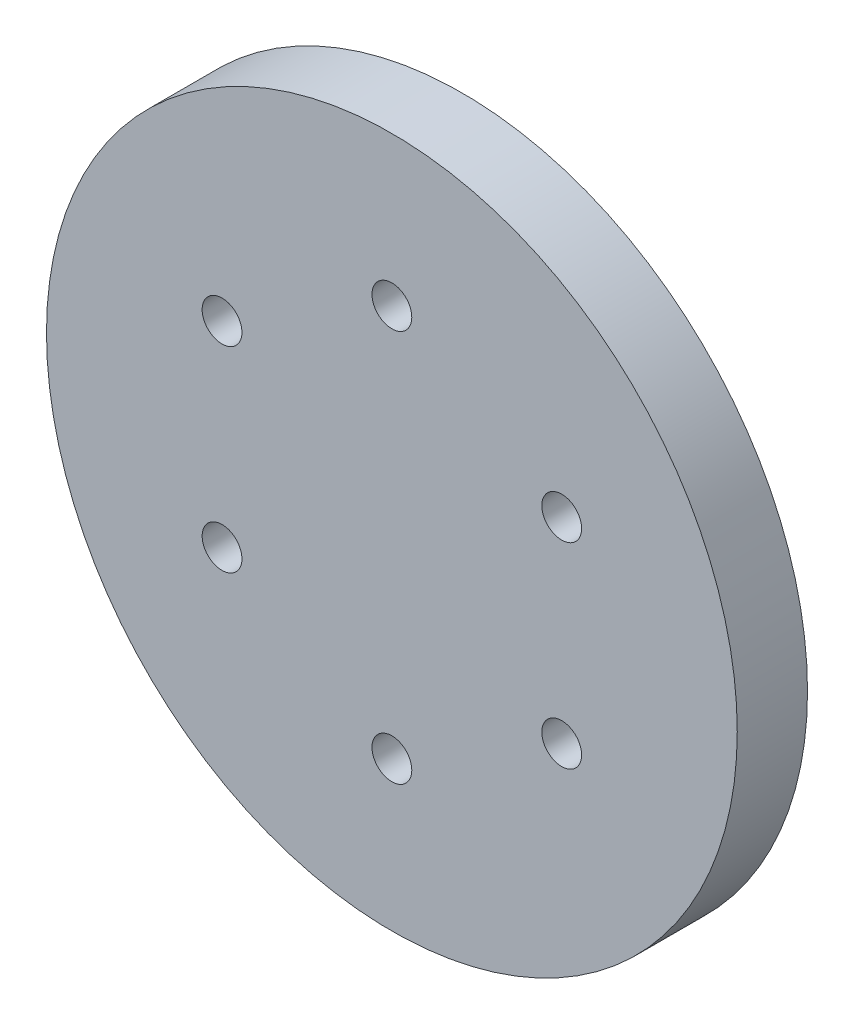
ISO-10303-21;
HEADER;
FILE_DESCRIPTION(('STEP AP214'),'2;1');
FILE_NAME('part.step','',(''),(''),'','','');
FILE_SCHEMA(('AUTOMOTIVE_DESIGN { 1 0 10303 214 1 1 1 1 }'));
ENDSEC;
DATA;
#1=APPLICATION_CONTEXT('core data for automotive mechanical design processes');
#2=APPLICATION_PROTOCOL_DEFINITION('international standard','automotive_design',2000,#1);
#3=PRODUCT_CONTEXT('',#1,'mechanical');
#4=PRODUCT('Part','Part','',(#3));
#5=PRODUCT_RELATED_PRODUCT_CATEGORY('part','',(#4));
#6=PRODUCT_DEFINITION_FORMATION('','',#4);
#7=PRODUCT_DEFINITION_CONTEXT('part definition',#1,'design');
#8=PRODUCT_DEFINITION('design','',#6,#7);
#9=PRODUCT_DEFINITION_SHAPE('','',#8);
#10=(LENGTH_UNIT() NAMED_UNIT(*) SI_UNIT(.MILLI.,.METRE.));
#11=(NAMED_UNIT(*) PLANE_ANGLE_UNIT() SI_UNIT($,.RADIAN.));
#12=(NAMED_UNIT(*) SI_UNIT($,.STERADIAN.) SOLID_ANGLE_UNIT());
#13=UNCERTAINTY_MEASURE_WITH_UNIT(LENGTH_MEASURE(1.E-05),#10,'distance_accuracy_value','');
#14=(GEOMETRIC_REPRESENTATION_CONTEXT(3) GLOBAL_UNCERTAINTY_ASSIGNED_CONTEXT((#13)) GLOBAL_UNIT_ASSIGNED_CONTEXT((#10,
#11,#12)) REPRESENTATION_CONTEXT('',''));
#15=CARTESIAN_POINT('',(0.,0.,0.));
#16=DIRECTION('',(0.,0.,1.));
#17=DIRECTION('',(1.,0.,0.));
#18=AXIS2_PLACEMENT_3D('',#15,#16,#17);
#19=CARTESIAN_POINT('',(0.,0.,3.));
#20=DIRECTION('',(0.,0.,1.));
#21=DIRECTION('',(1.,0.,0.));
#22=AXIS2_PLACEMENT_3D('',#19,#20,#21);
#23=PLANE('',#22);
#24=CARTESIAN_POINT('',(14.5059255133892,-8.37500000000027,3.));
#25=DIRECTION('',(0.,0.,1.));
#26=DIRECTION('',(1.,0.,0.));
#27=AXIS2_PLACEMENT_3D('',#24,#25,#26);
#28=CIRCLE('',#27,1.7);
#29=CARTESIAN_POINT('',(16.2059255133892,-8.37500000000027,3.));
#30=VERTEX_POINT('',#29);
#31=EDGE_CURVE('E88',#30,#30,#28,.T.);
#32=ORIENTED_EDGE('',*,*,#31,.F.);
#33=EDGE_LOOP('',(#32));
#34=FACE_BOUND('',#33,.T.);
#35=CARTESIAN_POINT('',(2.37657116208823E-13,16.75,3.));
#36=DIRECTION('',(0.,0.,1.));
#37=DIRECTION('',(1.,0.,0.));
#38=AXIS2_PLACEMENT_3D('',#35,#36,#37);
#39=CIRCLE('',#38,1.7);
#40=CARTESIAN_POINT('',(1.70000000000024,16.75,3.));
#41=VERTEX_POINT('',#40);
#42=EDGE_CURVE('E72',#41,#41,#39,.T.);
#43=ORIENTED_EDGE('',*,*,#42,.F.);
#44=EDGE_LOOP('',(#43));
#45=FACE_BOUND('',#44,.T.);
#46=CARTESIAN_POINT('',(-14.5059255133894,-8.37499999999986,3.));
#47=DIRECTION('',(0.,0.,1.));
#48=DIRECTION('',(1.,0.,0.));
#49=AXIS2_PLACEMENT_3D('',#46,#47,#48);
#50=CIRCLE('',#49,1.7);
#51=CARTESIAN_POINT('',(-12.8059255133894,-8.37499999999986,3.));
#52=VERTEX_POINT('',#51);
#53=EDGE_CURVE('E53',#52,#52,#50,.T.);
#54=ORIENTED_EDGE('',*,*,#53,.F.);
#55=EDGE_LOOP('',(#54));
#56=FACE_BOUND('',#55,.T.);
#57=CARTESIAN_POINT('',(-14.5059255133893,8.37500000000017,3.));
#58=DIRECTION('',(0.,0.,1.));
#59=DIRECTION('',(1.,0.,0.));
#60=AXIS2_PLACEMENT_3D('',#57,#58,#59);
#61=CIRCLE('',#60,1.7);
#62=CARTESIAN_POINT('',(-12.8059255133893,8.37500000000017,3.));
#63=VERTEX_POINT('',#62);
#64=EDGE_CURVE('E67',#63,#63,#61,.T.);
#65=ORIENTED_EDGE('',*,*,#64,.F.);
#66=EDGE_LOOP('',(#65));
#67=FACE_BOUND('',#66,.T.);
#68=CARTESIAN_POINT('',(14.5059255133895,8.37499999999976,3.));
#69=DIRECTION('',(0.,0.,1.));
#70=DIRECTION('',(1.,0.,0.));
#71=AXIS2_PLACEMENT_3D('',#68,#69,#70);
#72=CIRCLE('',#71,1.7);
#73=CARTESIAN_POINT('',(16.2059255133895,8.37499999999976,3.));
#74=VERTEX_POINT('',#73);
#75=EDGE_CURVE('E80',#74,#74,#72,.T.);
#76=ORIENTED_EDGE('',*,*,#75,.F.);
#77=EDGE_LOOP('',(#76));
#78=FACE_BOUND('',#77,.T.);
#79=CARTESIAN_POINT('',(-3.5301622736128E-13,-16.75,3.));
#80=DIRECTION('',(0.,0.,1.));
#81=DIRECTION('',(1.,0.,0.));
#82=AXIS2_PLACEMENT_3D('',#79,#80,#81);
#83=CIRCLE('',#82,1.7);
#84=CARTESIAN_POINT('',(1.69999999999965,-16.75,3.));
#85=VERTEX_POINT('',#84);
#86=EDGE_CURVE('E96',#85,#85,#83,.T.);
#87=ORIENTED_EDGE('',*,*,#86,.F.);
#88=EDGE_LOOP('',(#87));
#89=FACE_BOUND('',#88,.T.);
#90=CARTESIAN_POINT('',(0.,0.,3.));
#91=DIRECTION('',(0.,0.,1.));
#92=DIRECTION('',(1.,0.,0.));
#93=AXIS2_PLACEMENT_3D('',#90,#91,#92);
#94=CIRCLE('',#93,29.5);
#95=CARTESIAN_POINT('',(29.5,0.,3.));
#96=VERTEX_POINT('',#95);
#97=EDGE_CURVE('E107',#96,#96,#94,.T.);
#98=ORIENTED_EDGE('',*,*,#97,.T.);
#99=EDGE_LOOP('',(#98));
#100=FACE_BOUND('',#99,.T.);
#101=ADVANCED_FACE('F45',(#34,#45,#56,#67,#78,#89,#100),#23,.T.);
#102=CARTESIAN_POINT('',(0.,0.,0.));
#103=DIRECTION('',(0.,0.,1.));
#104=DIRECTION('',(1.,0.,0.));
#105=AXIS2_PLACEMENT_3D('',#102,#103,#104);
#106=PLANE('',#105);
#107=CARTESIAN_POINT('',(0.,0.,0.));
#108=DIRECTION('',(0.,0.,1.));
#109=DIRECTION('',(1.,0.,0.));
#110=AXIS2_PLACEMENT_3D('',#107,#108,#109);
#111=CIRCLE('',#110,27.6);
#112=CARTESIAN_POINT('',(27.6,0.,0.));
#113=VERTEX_POINT('',#112);
#114=EDGE_CURVE('E10',#113,#113,#111,.T.);
#115=ORIENTED_EDGE('',*,*,#114,.F.);
#116=EDGE_LOOP('',(#115));
#117=FACE_BOUND('',#116,.T.);
#118=CARTESIAN_POINT('',(-14.5059255133894,-8.37499999999986,0.));
#119=DIRECTION('',(0.,0.,1.));
#120=DIRECTION('',(1.,0.,0.));
#121=AXIS2_PLACEMENT_3D('',#118,#119,#120);
#122=CIRCLE('',#121,1.7);
#123=CARTESIAN_POINT('',(-12.8059255133894,-8.37499999999986,0.));
#124=VERTEX_POINT('',#123);
#125=EDGE_CURVE('E59',#124,#124,#122,.T.);
#126=ORIENTED_EDGE('',*,*,#125,.T.);
#127=EDGE_LOOP('',(#126));
#128=FACE_BOUND('',#127,.T.);
#129=CARTESIAN_POINT('',(-14.5059255133893,8.37500000000017,0.));
#130=DIRECTION('',(0.,0.,1.));
#131=DIRECTION('',(1.,0.,0.));
#132=AXIS2_PLACEMENT_3D('',#129,#130,#131);
#133=CIRCLE('',#132,1.7);
#134=CARTESIAN_POINT('',(-12.8059255133893,8.37500000000017,0.));
#135=VERTEX_POINT('',#134);
#136=EDGE_CURVE('E69',#135,#135,#133,.T.);
#137=ORIENTED_EDGE('',*,*,#136,.T.);
#138=EDGE_LOOP('',(#137));
#139=FACE_BOUND('',#138,.T.);
#140=CARTESIAN_POINT('',(2.37657116208823E-13,16.75,0.));
#141=DIRECTION('',(0.,0.,1.));
#142=DIRECTION('',(1.,0.,0.));
#143=AXIS2_PLACEMENT_3D('',#140,#141,#142);
#144=CIRCLE('',#143,1.7);
#145=CARTESIAN_POINT('',(1.70000000000024,16.75,0.));
#146=VERTEX_POINT('',#145);
#147=EDGE_CURVE('E76',#146,#146,#144,.T.);
#148=ORIENTED_EDGE('',*,*,#147,.T.);
#149=EDGE_LOOP('',(#148));
#150=FACE_BOUND('',#149,.T.);
#151=CARTESIAN_POINT('',(14.5059255133895,8.37499999999976,0.));
#152=DIRECTION('',(0.,0.,1.));
#153=DIRECTION('',(1.,0.,0.));
#154=AXIS2_PLACEMENT_3D('',#151,#152,#153);
#155=CIRCLE('',#154,1.7);
#156=CARTESIAN_POINT('',(16.2059255133895,8.37499999999976,0.));
#157=VERTEX_POINT('',#156);
#158=EDGE_CURVE('E84',#157,#157,#155,.T.);
#159=ORIENTED_EDGE('',*,*,#158,.T.);
#160=EDGE_LOOP('',(#159));
#161=FACE_BOUND('',#160,.T.);
#162=CARTESIAN_POINT('',(14.5059255133892,-8.37500000000027,0.));
#163=DIRECTION('',(0.,0.,1.));
#164=DIRECTION('',(1.,0.,0.));
#165=AXIS2_PLACEMENT_3D('',#162,#163,#164);
#166=CIRCLE('',#165,1.7);
#167=CARTESIAN_POINT('',(16.2059255133892,-8.37500000000027,0.));
#168=VERTEX_POINT('',#167);
#169=EDGE_CURVE('E92',#168,#168,#166,.T.);
#170=ORIENTED_EDGE('',*,*,#169,.T.);
#171=EDGE_LOOP('',(#170));
#172=FACE_BOUND('',#171,.T.);
#173=CARTESIAN_POINT('',(-3.5301622736128E-13,-16.75,0.));
#174=DIRECTION('',(0.,0.,1.));
#175=DIRECTION('',(1.,0.,0.));
#176=AXIS2_PLACEMENT_3D('',#173,#174,#175);
#177=CIRCLE('',#176,1.7);
#178=CARTESIAN_POINT('',(1.69999999999965,-16.75,0.));
#179=VERTEX_POINT('',#178);
#180=EDGE_CURVE('E100',#179,#179,#177,.T.);
#181=ORIENTED_EDGE('',*,*,#180,.T.);
#182=EDGE_LOOP('',(#181));
#183=FACE_BOUND('',#182,.T.);
#184=ADVANCED_FACE('F47',(#117,#128,#139,#150,#161,#172,#183),#106,.F.);
#185=CARTESIAN_POINT('',(-14.5059255133894,-8.37499999999986,3.));
#186=DIRECTION('',(0.,0.,-1.));
#187=DIRECTION('',(-1.,0.,0.));
#188=AXIS2_PLACEMENT_3D('',#185,#186,#187);
#189=CYLINDRICAL_SURFACE('',#188,1.7);
#190=ORIENTED_EDGE('',*,*,#53,.T.);
#191=EDGE_LOOP('',(#190));
#192=FACE_BOUND('',#191,.T.);
#193=ORIENTED_EDGE('',*,*,#125,.F.);
#194=EDGE_LOOP('',(#193));
#195=FACE_BOUND('',#194,.T.);
#196=ADVANCED_FACE('F138',(#192,#195),#189,.F.);
#197=CARTESIAN_POINT('',(-14.5059255133893,8.37500000000017,3.));
#198=DIRECTION('',(0.,0.,-1.));
#199=DIRECTION('',(-1.,0.,0.));
#200=AXIS2_PLACEMENT_3D('',#197,#198,#199);
#201=CYLINDRICAL_SURFACE('',#200,1.7);
#202=ORIENTED_EDGE('',*,*,#64,.T.);
#203=EDGE_LOOP('',(#202));
#204=FACE_BOUND('',#203,.T.);
#205=ORIENTED_EDGE('',*,*,#136,.F.);
#206=EDGE_LOOP('',(#205));
#207=FACE_BOUND('',#206,.T.);
#208=ADVANCED_FACE('F145',(#204,#207),#201,.F.);
#209=CARTESIAN_POINT('',(2.37657116208823E-13,16.75,3.));
#210=DIRECTION('',(0.,0.,-1.));
#211=DIRECTION('',(-1.,0.,0.));
#212=AXIS2_PLACEMENT_3D('',#209,#210,#211);
#213=CYLINDRICAL_SURFACE('',#212,1.7);
#214=ORIENTED_EDGE('',*,*,#42,.T.);
#215=EDGE_LOOP('',(#214));
#216=FACE_BOUND('',#215,.T.);
#217=ORIENTED_EDGE('',*,*,#147,.F.);
#218=EDGE_LOOP('',(#217));
#219=FACE_BOUND('',#218,.T.);
#220=ADVANCED_FACE('F148',(#216,#219),#213,.F.);
#221=CARTESIAN_POINT('',(14.5059255133895,8.37499999999976,3.));
#222=DIRECTION('',(0.,0.,-1.));
#223=DIRECTION('',(-1.,0.,0.));
#224=AXIS2_PLACEMENT_3D('',#221,#222,#223);
#225=CYLINDRICAL_SURFACE('',#224,1.7);
#226=ORIENTED_EDGE('',*,*,#75,.T.);
#227=EDGE_LOOP('',(#226));
#228=FACE_BOUND('',#227,.T.);
#229=ORIENTED_EDGE('',*,*,#158,.F.);
#230=EDGE_LOOP('',(#229));
#231=FACE_BOUND('',#230,.T.);
#232=ADVANCED_FACE('F152',(#228,#231),#225,.F.);
#233=CARTESIAN_POINT('',(14.5059255133892,-8.37500000000027,3.));
#234=DIRECTION('',(0.,0.,-1.));
#235=DIRECTION('',(-1.,0.,0.));
#236=AXIS2_PLACEMENT_3D('',#233,#234,#235);
#237=CYLINDRICAL_SURFACE('',#236,1.7);
#238=ORIENTED_EDGE('',*,*,#31,.T.);
#239=EDGE_LOOP('',(#238));
#240=FACE_BOUND('',#239,.T.);
#241=ORIENTED_EDGE('',*,*,#169,.F.);
#242=EDGE_LOOP('',(#241));
#243=FACE_BOUND('',#242,.T.);
#244=ADVANCED_FACE('F131',(#240,#243),#237,.F.);
#245=CARTESIAN_POINT('',(-3.5301622736128E-13,-16.75,3.));
#246=DIRECTION('',(0.,0.,-1.));
#247=DIRECTION('',(-1.,0.,0.));
#248=AXIS2_PLACEMENT_3D('',#245,#246,#247);
#249=CYLINDRICAL_SURFACE('',#248,1.7);
#250=ORIENTED_EDGE('',*,*,#86,.T.);
#251=EDGE_LOOP('',(#250));
#252=FACE_BOUND('',#251,.T.);
#253=ORIENTED_EDGE('',*,*,#180,.F.);
#254=EDGE_LOOP('',(#253));
#255=FACE_BOUND('',#254,.T.);
#256=ADVANCED_FACE('F124',(#252,#255),#249,.F.);
#257=CARTESIAN_POINT('',(0.,0.,-3.));
#258=DIRECTION('',(0.,0.,1.));
#259=DIRECTION('',(1.,0.,0.));
#260=AXIS2_PLACEMENT_3D('',#257,#258,#259);
#261=CYLINDRICAL_SURFACE('',#260,27.6);
#262=CARTESIAN_POINT('',(0.,0.,-3.));
#263=DIRECTION('',(0.,0.,1.));
#264=DIRECTION('',(1.,0.,0.));
#265=AXIS2_PLACEMENT_3D('',#262,#263,#264);
#266=CIRCLE('',#265,27.6);
#267=CARTESIAN_POINT('',(27.6,0.,-3.));
#268=VERTEX_POINT('',#267);
#269=EDGE_CURVE('E111',#268,#268,#266,.T.);
#270=ORIENTED_EDGE('',*,*,#269,.F.);
#271=EDGE_LOOP('',(#270));
#272=FACE_BOUND('',#271,.T.);
#273=ORIENTED_EDGE('',*,*,#114,.T.);
#274=EDGE_LOOP('',(#273));
#275=FACE_BOUND('',#274,.T.);
#276=ADVANCED_FACE('F121',(#272,#275),#261,.F.);
#277=CARTESIAN_POINT('',(0.,0.,-3.));
#278=DIRECTION('',(0.,0.,1.));
#279=DIRECTION('',(1.,0.,0.));
#280=AXIS2_PLACEMENT_3D('',#277,#278,#279);
#281=CYLINDRICAL_SURFACE('',#280,29.5);
#282=CARTESIAN_POINT('',(0.,0.,-3.));
#283=DIRECTION('',(0.,0.,1.));
#284=DIRECTION('',(1.,0.,0.));
#285=AXIS2_PLACEMENT_3D('',#282,#283,#284);
#286=CIRCLE('',#285,29.5);
#287=CARTESIAN_POINT('',(29.5,0.,-3.));
#288=VERTEX_POINT('',#287);
#289=EDGE_CURVE('E104',#288,#288,#286,.T.);
#290=ORIENTED_EDGE('',*,*,#289,.T.);
#291=EDGE_LOOP('',(#290));
#292=FACE_BOUND('',#291,.T.);
#293=ORIENTED_EDGE('',*,*,#97,.F.);
#294=EDGE_LOOP('',(#293));
#295=FACE_BOUND('',#294,.T.);
#296=ADVANCED_FACE('F123',(#292,#295),#281,.T.);
#297=CARTESIAN_POINT('',(0.,0.,-3.));
#298=DIRECTION('',(0.,0.,1.));
#299=DIRECTION('',(1.,0.,0.));
#300=AXIS2_PLACEMENT_3D('',#297,#298,#299);
#301=PLANE('',#300);
#302=ORIENTED_EDGE('',*,*,#269,.T.);
#303=EDGE_LOOP('',(#302));
#304=FACE_BOUND('',#303,.T.);
#305=ORIENTED_EDGE('',*,*,#289,.F.);
#306=EDGE_LOOP('',(#305));
#307=FACE_BOUND('',#306,.T.);
#308=ADVANCED_FACE('F118',(#304,#307),#301,.F.);
#309=CLOSED_SHELL('',(#101,#184,#196,#208,#220,#232,#244,#256,#276,#296,#308));
#310=MANIFOLD_SOLID_BREP('B2',#309);
#311=ADVANCED_BREP_SHAPE_REPRESENTATION('',(#18,#310),#14);
#312=SHAPE_DEFINITION_REPRESENTATION(#9,#311);
ENDSEC;
END-ISO-10303-21;
